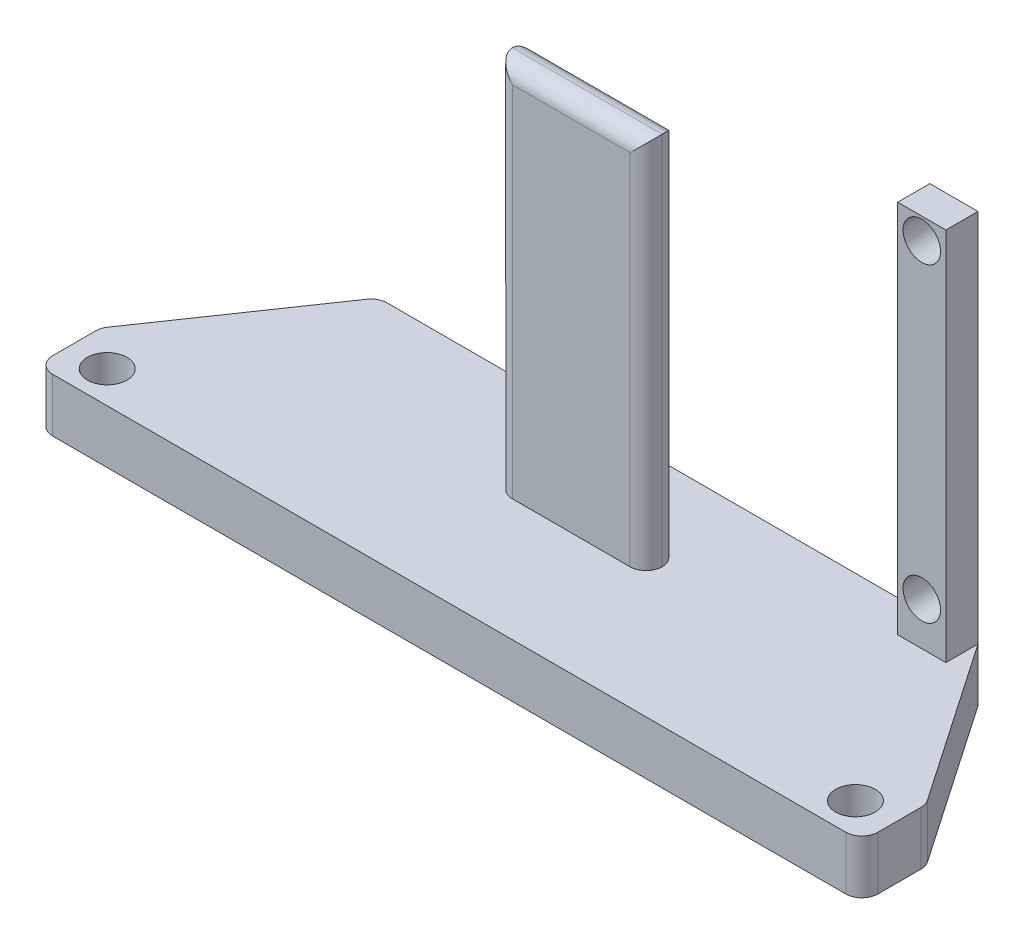
ISO-10303-21;
HEADER;
FILE_DESCRIPTION(('STEP AP214'),'2;1');
FILE_NAME('part.step','',(''),(''),'','','');
FILE_SCHEMA(('AUTOMOTIVE_DESIGN { 1 0 10303 214 1 1 1 1 }'));
ENDSEC;
DATA;
#1=APPLICATION_CONTEXT('core data for automotive mechanical design processes');
#2=APPLICATION_PROTOCOL_DEFINITION('international standard','automotive_design',2000,#1);
#3=PRODUCT_CONTEXT('',#1,'mechanical');
#4=PRODUCT('Part','Part','',(#3));
#5=PRODUCT_RELATED_PRODUCT_CATEGORY('part','',(#4));
#6=PRODUCT_DEFINITION_FORMATION('','',#4);
#7=PRODUCT_DEFINITION_CONTEXT('part definition',#1,'design');
#8=PRODUCT_DEFINITION('design','',#6,#7);
#9=PRODUCT_DEFINITION_SHAPE('','',#8);
#10=(LENGTH_UNIT() NAMED_UNIT(*) SI_UNIT(.MILLI.,.METRE.));
#11=(NAMED_UNIT(*) PLANE_ANGLE_UNIT() SI_UNIT($,.RADIAN.));
#12=(NAMED_UNIT(*) SI_UNIT($,.STERADIAN.) SOLID_ANGLE_UNIT());
#13=UNCERTAINTY_MEASURE_WITH_UNIT(LENGTH_MEASURE(1.E-05),#10,'distance_accuracy_value','');
#14=(GEOMETRIC_REPRESENTATION_CONTEXT(3) GLOBAL_UNCERTAINTY_ASSIGNED_CONTEXT((#13)) GLOBAL_UNIT_ASSIGNED_CONTEXT((#10,
#11,#12)) REPRESENTATION_CONTEXT('',''));
#15=CARTESIAN_POINT('',(0.,0.,0.));
#16=DIRECTION('',(0.,0.,1.));
#17=DIRECTION('',(1.,0.,0.));
#18=AXIS2_PLACEMENT_3D('',#15,#16,#17);
#19=CARTESIAN_POINT('',(0.,0.,0.));
#20=DIRECTION('',(0.,1.,0.));
#21=DIRECTION('',(0.,0.,1.));
#22=AXIS2_PLACEMENT_3D('',#19,#20,#21);
#23=PLANE('',#22);
#24=DIRECTION('',(1.,0.,0.));
#25=VECTOR('',#24,1.);
#26=CARTESIAN_POINT('',(-38.55,0.,0.));
#27=LINE('',#26,#25);
#28=CARTESIAN_POINT('',(-37.05,0.,0.));
#29=VERTEX_POINT('',#28);
#30=CARTESIAN_POINT('',(37.05,0.,0.));
#31=VERTEX_POINT('',#30);
#32=EDGE_CURVE('E248',#29,#31,#27,.T.);
#33=ORIENTED_EDGE('',*,*,#32,.T.);
#34=CARTESIAN_POINT('',(37.05,0.,-1.5));
#35=DIRECTION('',(0.,1.,0.));
#36=DIRECTION('',(0.,0.,1.));
#37=AXIS2_PLACEMENT_3D('',#34,#35,#36);
#38=CIRCLE('',#37,1.5);
#39=CARTESIAN_POINT('',(38.55,0.,-1.5));
#40=VERTEX_POINT('',#39);
#41=EDGE_CURVE('E326',#31,#40,#38,.T.);
#42=ORIENTED_EDGE('',*,*,#41,.T.);
#43=DIRECTION('',(0.,0.,-1.));
#44=VECTOR('',#43,1.);
#45=CARTESIAN_POINT('',(38.55,0.,0.));
#46=LINE('',#45,#44);
#47=CARTESIAN_POINT('',(38.55,0.,-5.53547626189279));
#48=VERTEX_POINT('',#47);
#49=EDGE_CURVE('E251',#40,#48,#46,.T.);
#50=ORIENTED_EDGE('',*,*,#49,.T.);
#51=CARTESIAN_POINT('',(37.05,0.,-5.53547626189279));
#52=DIRECTION('',(0.,1.,0.));
#53=DIRECTION('',(0.,0.,1.));
#54=AXIS2_PLACEMENT_3D('',#51,#52,#53);
#55=CIRCLE('',#54,1.5);
#56=CARTESIAN_POINT('',(38.2874679391047,0.,-6.3832221552405));
#57=VERTEX_POINT('',#56);
#58=EDGE_CURVE('E324',#48,#57,#55,.T.);
#59=ORIENTED_EDGE('',*,*,#58,.T.);
#60=DIRECTION('',(-0.565163928898476,0.,-0.824978626069814));
#61=VECTOR('',#60,1.);
#62=CARTESIAN_POINT('',(38.55,0.,-6.));
#63=LINE('',#62,#61);
#64=CARTESIAN_POINT('',(28.,0.,-21.4));
#65=VERTEX_POINT('',#64);
#66=EDGE_CURVE('E254',#57,#65,#63,.T.);
#67=ORIENTED_EDGE('',*,*,#66,.T.);
#68=DIRECTION('',(0.,0.,-1.));
#69=VECTOR('',#68,1.);
#70=CARTESIAN_POINT('',(28.,0.,-21.4));
#71=LINE('',#70,#69);
#72=CARTESIAN_POINT('',(28.,0.,-18.4));
#73=VERTEX_POINT('',#72);
#74=EDGE_CURVE('E209',#73,#65,#71,.T.);
#75=ORIENTED_EDGE('',*,*,#74,.F.);
#76=DIRECTION('',(1.,0.,0.));
#77=VECTOR('',#76,1.);
#78=CARTESIAN_POINT('',(28.,0.,-18.4));
#79=LINE('',#78,#77);
#80=CARTESIAN_POINT('',(23.5,0.,-18.4));
#81=VERTEX_POINT('',#80);
#82=EDGE_CURVE('E206',#81,#73,#79,.T.);
#83=ORIENTED_EDGE('',*,*,#82,.F.);
#84=DIRECTION('',(0.,0.,1.));
#85=VECTOR('',#84,1.);
#86=CARTESIAN_POINT('',(23.5,0.,-21.4));
#87=LINE('',#86,#85);
#88=CARTESIAN_POINT('',(23.5,0.,-21.4));
#89=VERTEX_POINT('',#88);
#90=EDGE_CURVE('E376',#89,#81,#87,.T.);
#91=ORIENTED_EDGE('',*,*,#90,.F.);
#92=DIRECTION('',(-1.,0.,0.));
#93=VECTOR('',#92,1.);
#94=CARTESIAN_POINT('',(28.,0.,-21.4));
#95=LINE('',#94,#93);
#96=CARTESIAN_POINT('',(-27.2093684781149,0.,-21.4));
#97=VERTEX_POINT('',#96);
#98=EDGE_CURVE('E256',#89,#97,#95,.T.);
#99=ORIENTED_EDGE('',*,*,#98,.T.);
#100=CARTESIAN_POINT('',(-27.2093684781149,0.,-19.9));
#101=DIRECTION('',(0.,1.,0.));
#102=DIRECTION('',(0.,0.,1.));
#103=AXIS2_PLACEMENT_3D('',#100,#101,#102);
#104=CIRCLE('',#103,1.5);
#105=CARTESIAN_POINT('',(-28.4468364172196,0.,-20.7477458933477));
#106=VERTEX_POINT('',#105);
#107=EDGE_CURVE('E322',#97,#106,#104,.T.);
#108=ORIENTED_EDGE('',*,*,#107,.T.);
#109=DIRECTION('',(-0.565163928898476,0.,0.824978626069814));
#110=VECTOR('',#109,1.);
#111=CARTESIAN_POINT('',(-38.55,0.,-6.));
#112=LINE('',#111,#110);
#113=CARTESIAN_POINT('',(-38.2874679391047,0.,-6.3832221552405));
#114=VERTEX_POINT('',#113);
#115=EDGE_CURVE('E232',#106,#114,#112,.T.);
#116=ORIENTED_EDGE('',*,*,#115,.T.);
#117=CARTESIAN_POINT('',(-37.05,0.,-5.53547626189279));
#118=DIRECTION('',(0.,1.,0.));
#119=DIRECTION('',(0.,0.,1.));
#120=AXIS2_PLACEMENT_3D('',#117,#118,#119);
#121=CIRCLE('',#120,1.5);
#122=CARTESIAN_POINT('',(-38.55,0.,-5.53547626189279));
#123=VERTEX_POINT('',#122);
#124=EDGE_CURVE('E320',#114,#123,#121,.T.);
#125=ORIENTED_EDGE('',*,*,#124,.T.);
#126=DIRECTION('',(0.,0.,1.));
#127=VECTOR('',#126,1.);
#128=CARTESIAN_POINT('',(-38.55,0.,0.));
#129=LINE('',#128,#127);
#130=CARTESIAN_POINT('',(-38.55,0.,-1.5));
#131=VERTEX_POINT('',#130);
#132=EDGE_CURVE('E225',#123,#131,#129,.T.);
#133=ORIENTED_EDGE('',*,*,#132,.T.);
#134=CARTESIAN_POINT('',(-37.05,0.,-1.5));
#135=DIRECTION('',(0.,1.,0.));
#136=DIRECTION('',(0.,0.,1.));
#137=AXIS2_PLACEMENT_3D('',#134,#135,#136);
#138=CIRCLE('',#137,1.5);
#139=EDGE_CURVE('E318',#131,#29,#138,.T.);
#140=ORIENTED_EDGE('',*,*,#139,.T.);
#141=EDGE_LOOP('',(#33,#42,#50,#59,#67,#75,#83,#91,#99,#108,#116,#125,#133,#140));
#142=FACE_BOUND('',#141,.T.);
#143=CARTESIAN_POINT('',(34.95,0.,-3.));
#144=DIRECTION('',(0.,1.,0.));
#145=DIRECTION('',(0.,0.,1.));
#146=AXIS2_PLACEMENT_3D('',#143,#144,#145);
#147=CIRCLE('',#146,1.85);
#148=CARTESIAN_POINT('',(34.95,0.,-1.15));
#149=VERTEX_POINT('',#148);
#150=EDGE_CURVE('E210',#149,#149,#147,.T.);
#151=ORIENTED_EDGE('',*,*,#150,.F.);
#152=EDGE_LOOP('',(#151));
#153=FACE_BOUND('',#152,.T.);
#154=CARTESIAN_POINT('',(-34.95,0.,-3.));
#155=DIRECTION('',(0.,1.,0.));
#156=DIRECTION('',(0.,0.,1.));
#157=AXIS2_PLACEMENT_3D('',#154,#155,#156);
#158=CIRCLE('',#157,1.85);
#159=CARTESIAN_POINT('',(-34.95,0.,-1.15));
#160=VERTEX_POINT('',#159);
#161=EDGE_CURVE('E220',#160,#160,#158,.T.);
#162=ORIENTED_EDGE('',*,*,#161,.F.);
#163=EDGE_LOOP('',(#162));
#164=FACE_BOUND('',#163,.T.);
#165=DIRECTION('',(1.,0.,0.));
#166=VECTOR('',#165,1.);
#167=CARTESIAN_POINT('',(-7.,0.,-11.4));
#168=LINE('',#167,#166);
#169=CARTESIAN_POINT('',(-5.5,0.,-11.4));
#170=VERTEX_POINT('',#169);
#171=CARTESIAN_POINT('',(5.5,0.,-11.4));
#172=VERTEX_POINT('',#171);
#173=EDGE_CURVE('E383',#170,#172,#168,.T.);
#174=ORIENTED_EDGE('',*,*,#173,.F.);
#175=CARTESIAN_POINT('',(-5.5,0.,-12.9));
#176=DIRECTION('',(0.,1.,0.));
#177=DIRECTION('',(0.,0.,1.));
#178=AXIS2_PLACEMENT_3D('',#175,#176,#177);
#179=CIRCLE('',#178,1.5);
#180=CARTESIAN_POINT('',(-7.,0.,-12.9));
#181=VERTEX_POINT('',#180);
#182=EDGE_CURVE('E286',#170,#181,#179,.F.);
#183=ORIENTED_EDGE('',*,*,#182,.T.);
#184=CARTESIAN_POINT('',(-5.5,0.,-12.9));
#185=DIRECTION('',(0.,1.,0.));
#186=DIRECTION('',(0.,0.,1.));
#187=AXIS2_PLACEMENT_3D('',#184,#185,#186);
#188=CIRCLE('',#187,1.5);
#189=CARTESIAN_POINT('',(-5.5,0.,-14.4));
#190=VERTEX_POINT('',#189);
#191=EDGE_CURVE('E284',#181,#190,#188,.F.);
#192=ORIENTED_EDGE('',*,*,#191,.T.);
#193=DIRECTION('',(-1.,0.,0.));
#194=VECTOR('',#193,1.);
#195=CARTESIAN_POINT('',(-7.,0.,-14.4));
#196=LINE('',#195,#194);
#197=CARTESIAN_POINT('',(5.5,0.,-14.4));
#198=VERTEX_POINT('',#197);
#199=EDGE_CURVE('E271',#198,#190,#196,.T.);
#200=ORIENTED_EDGE('',*,*,#199,.F.);
#201=CARTESIAN_POINT('',(5.5,0.,-12.9));
#202=DIRECTION('',(0.,1.,0.));
#203=DIRECTION('',(0.,0.,1.));
#204=AXIS2_PLACEMENT_3D('',#201,#202,#203);
#205=CIRCLE('',#204,1.5);
#206=CARTESIAN_POINT('',(7.,0.,-12.9));
#207=VERTEX_POINT('',#206);
#208=EDGE_CURVE('E288',#198,#207,#205,.F.);
#209=ORIENTED_EDGE('',*,*,#208,.T.);
#210=CARTESIAN_POINT('',(5.5,0.,-12.9));
#211=DIRECTION('',(0.,1.,0.));
#212=DIRECTION('',(0.,0.,1.));
#213=AXIS2_PLACEMENT_3D('',#210,#211,#212);
#214=CIRCLE('',#213,1.5);
#215=EDGE_CURVE('E290',#207,#172,#214,.F.);
#216=ORIENTED_EDGE('',*,*,#215,.T.);
#217=EDGE_LOOP('',(#174,#183,#192,#200,#209,#216));
#218=FACE_BOUND('',#217,.T.);
#219=ADVANCED_FACE('F42',(#142,#153,#164,#218),#23,.T.);
#220=CARTESIAN_POINT('',(-38.55,-5.,0.));
#221=DIRECTION('',(-1.,0.,0.));
#222=DIRECTION('',(0.,0.,1.));
#223=AXIS2_PLACEMENT_3D('',#220,#221,#222);
#224=PLANE('',#223);
#225=ORIENTED_EDGE('',*,*,#132,.F.);
#226=DIRECTION('',(0.,1.,0.));
#227=VECTOR('',#226,1.);
#228=CARTESIAN_POINT('',(-38.55,-5.,-5.53547626189279));
#229=LINE('',#228,#227);
#230=CARTESIAN_POINT('',(-38.55,-5.,-5.53547626189279));
#231=VERTEX_POINT('',#230);
#232=EDGE_CURVE('E11',#123,#231,#229,.F.);
#233=ORIENTED_EDGE('',*,*,#232,.T.);
#234=DIRECTION('',(0.,0.,1.));
#235=VECTOR('',#234,1.);
#236=CARTESIAN_POINT('',(-38.55,-5.,0.));
#237=LINE('',#236,#235);
#238=CARTESIAN_POINT('',(-38.55,-5.,-1.5));
#239=VERTEX_POINT('',#238);
#240=EDGE_CURVE('E228',#231,#239,#237,.T.);
#241=ORIENTED_EDGE('',*,*,#240,.T.);
#242=DIRECTION('',(0.,1.,0.));
#243=VECTOR('',#242,1.);
#244=CARTESIAN_POINT('',(-38.55,-5.,-1.5));
#245=LINE('',#244,#243);
#246=EDGE_CURVE('E50',#239,#131,#245,.T.);
#247=ORIENTED_EDGE('',*,*,#246,.T.);
#248=EDGE_LOOP('',(#225,#233,#241,#247));
#249=FACE_BOUND('',#248,.T.);
#250=ADVANCED_FACE('F354',(#249),#224,.T.);
#251=CARTESIAN_POINT('',(-38.55,-5.,-6.));
#252=DIRECTION('',(-0.824978626069814,0.,-0.565163928898476));
#253=DIRECTION('',(-0.565163928898476,0.,0.824978626069814));
#254=AXIS2_PLACEMENT_3D('',#251,#252,#253);
#255=PLANE('',#254);
#256=ORIENTED_EDGE('',*,*,#115,.F.);
#257=DIRECTION('',(0.,1.,0.));
#258=VECTOR('',#257,1.);
#259=CARTESIAN_POINT('',(-28.4468364172196,-5.,-20.7477458933477));
#260=LINE('',#259,#258);
#261=CARTESIAN_POINT('',(-28.4468364172196,-5.,-20.7477458933477));
#262=VERTEX_POINT('',#261);
#263=EDGE_CURVE('E349',#106,#262,#260,.F.);
#264=ORIENTED_EDGE('',*,*,#263,.T.);
#265=DIRECTION('',(-0.565163928898476,0.,0.824978626069814));
#266=VECTOR('',#265,1.);
#267=CARTESIAN_POINT('',(-38.55,-5.,-6.));
#268=LINE('',#267,#266);
#269=CARTESIAN_POINT('',(-38.2874679391047,-5.,-6.3832221552405));
#270=VERTEX_POINT('',#269);
#271=EDGE_CURVE('E242',#262,#270,#268,.T.);
#272=ORIENTED_EDGE('',*,*,#271,.T.);
#273=DIRECTION('',(0.,1.,0.));
#274=VECTOR('',#273,1.);
#275=CARTESIAN_POINT('',(-38.2874679391047,-5.,-6.3832221552405));
#276=LINE('',#275,#274);
#277=EDGE_CURVE('E346',#270,#114,#276,.T.);
#278=ORIENTED_EDGE('',*,*,#277,.T.);
#279=EDGE_LOOP('',(#256,#264,#272,#278));
#280=FACE_BOUND('',#279,.T.);
#281=ADVANCED_FACE('F368',(#280),#255,.T.);
#282=CARTESIAN_POINT('',(28.,-5.,-21.4));
#283=DIRECTION('',(0.,0.,-1.));
#284=DIRECTION('',(-1.,0.,0.));
#285=AXIS2_PLACEMENT_3D('',#282,#283,#284);
#286=PLANE('',#285);
#287=CARTESIAN_POINT('',(25.75,33.,-21.4));
#288=DIRECTION('',(0.,0.,1.));
#289=DIRECTION('',(1.,0.,0.));
#290=AXIS2_PLACEMENT_3D('',#287,#288,#289);
#291=CIRCLE('',#290,1.75);
#292=CARTESIAN_POINT('',(27.5,33.,-21.4));
#293=VERTEX_POINT('',#292);
#294=EDGE_CURVE('E268',#293,#293,#291,.T.);
#295=ORIENTED_EDGE('',*,*,#294,.T.);
#296=EDGE_LOOP('',(#295));
#297=FACE_BOUND('',#296,.T.);
#298=CARTESIAN_POINT('',(25.75,4.,-21.4));
#299=DIRECTION('',(0.,0.,1.));
#300=DIRECTION('',(1.,0.,0.));
#301=AXIS2_PLACEMENT_3D('',#298,#299,#300);
#302=CIRCLE('',#301,1.75);
#303=CARTESIAN_POINT('',(27.5,4.,-21.4));
#304=VERTEX_POINT('',#303);
#305=EDGE_CURVE('E313',#304,#304,#302,.T.);
#306=ORIENTED_EDGE('',*,*,#305,.T.);
#307=EDGE_LOOP('',(#306));
#308=FACE_BOUND('',#307,.T.);
#309=DIRECTION('',(-1.,0.,0.));
#310=VECTOR('',#309,1.);
#311=CARTESIAN_POINT('',(28.,-5.,-21.4));
#312=LINE('',#311,#310);
#313=CARTESIAN_POINT('',(28.,-5.,-21.4));
#314=VERTEX_POINT('',#313);
#315=CARTESIAN_POINT('',(-27.2093684781149,-5.,-21.4));
#316=VERTEX_POINT('',#315);
#317=EDGE_CURVE('E240',#314,#316,#312,.T.);
#318=ORIENTED_EDGE('',*,*,#317,.T.);
#319=DIRECTION('',(0.,1.,0.));
#320=VECTOR('',#319,1.);
#321=CARTESIAN_POINT('',(-27.2093684781149,-5.,-21.4));
#322=LINE('',#321,#320);
#323=EDGE_CURVE('E343',#316,#97,#322,.T.);
#324=ORIENTED_EDGE('',*,*,#323,.T.);
#325=ORIENTED_EDGE('',*,*,#98,.F.);
#326=DIRECTION('',(0.,-1.,0.));
#327=VECTOR('',#326,1.);
#328=CARTESIAN_POINT('',(23.5,35.,-21.4));
#329=LINE('',#328,#327);
#330=CARTESIAN_POINT('',(23.5,35.,-21.4));
#331=VERTEX_POINT('',#330);
#332=EDGE_CURVE('E193',#331,#89,#329,.T.);
#333=ORIENTED_EDGE('',*,*,#332,.F.);
#334=DIRECTION('',(-1.,0.,0.));
#335=VECTOR('',#334,1.);
#336=CARTESIAN_POINT('',(28.,35.,-21.4));
#337=LINE('',#336,#335);
#338=CARTESIAN_POINT('',(28.,35.,-21.4));
#339=VERTEX_POINT('',#338);
#340=EDGE_CURVE('E184',#339,#331,#337,.T.);
#341=ORIENTED_EDGE('',*,*,#340,.F.);
#342=DIRECTION('',(0.,-1.,0.));
#343=VECTOR('',#342,1.);
#344=CARTESIAN_POINT('',(28.,35.,-21.4));
#345=LINE('',#344,#343);
#346=EDGE_CURVE('E189',#339,#65,#345,.T.);
#347=ORIENTED_EDGE('',*,*,#346,.T.);
#348=DIRECTION('',(0.,1.,0.));
#349=VECTOR('',#348,1.);
#350=CARTESIAN_POINT('',(28.,-5.,-21.4));
#351=LINE('',#350,#349);
#352=EDGE_CURVE('E245',#314,#65,#351,.T.);
#353=ORIENTED_EDGE('',*,*,#352,.F.);
#354=EDGE_LOOP('',(#318,#324,#325,#333,#341,#347,#353));
#355=FACE_BOUND('',#354,.T.);
#356=ADVANCED_FACE('F186',(#297,#308,#355),#286,.T.);
#357=CARTESIAN_POINT('',(38.55,-5.,-6.));
#358=DIRECTION('',(0.824978626069814,0.,-0.565163928898476));
#359=DIRECTION('',(-0.565163928898476,0.,-0.824978626069814));
#360=AXIS2_PLACEMENT_3D('',#357,#358,#359);
#361=PLANE('',#360);
#362=ORIENTED_EDGE('',*,*,#66,.F.);
#363=DIRECTION('',(0.,1.,0.));
#364=VECTOR('',#363,1.);
#365=CARTESIAN_POINT('',(38.2874679391047,-5.,-6.3832221552405));
#366=LINE('',#365,#364);
#367=CARTESIAN_POINT('',(38.2874679391047,-5.,-6.3832221552405));
#368=VERTEX_POINT('',#367);
#369=EDGE_CURVE('E57',#57,#368,#366,.F.);
#370=ORIENTED_EDGE('',*,*,#369,.T.);
#371=DIRECTION('',(-0.565163928898476,0.,-0.824978626069814));
#372=VECTOR('',#371,1.);
#373=CARTESIAN_POINT('',(38.55,-5.,-6.));
#374=LINE('',#373,#372);
#375=EDGE_CURVE('E238',#368,#314,#374,.T.);
#376=ORIENTED_EDGE('',*,*,#375,.T.);
#377=ORIENTED_EDGE('',*,*,#352,.T.);
#378=EDGE_LOOP('',(#362,#370,#376,#377));
#379=FACE_BOUND('',#378,.T.);
#380=ADVANCED_FACE('F444',(#379),#361,.T.);
#381=CARTESIAN_POINT('',(38.55,-5.,0.));
#382=DIRECTION('',(1.,0.,0.));
#383=DIRECTION('',(0.,0.,-1.));
#384=AXIS2_PLACEMENT_3D('',#381,#382,#383);
#385=PLANE('',#384);
#386=ORIENTED_EDGE('',*,*,#49,.F.);
#387=DIRECTION('',(0.,1.,0.));
#388=VECTOR('',#387,1.);
#389=CARTESIAN_POINT('',(38.55,-5.,-1.5));
#390=LINE('',#389,#388);
#391=CARTESIAN_POINT('',(38.55,-5.,-1.5));
#392=VERTEX_POINT('',#391);
#393=EDGE_CURVE('E331',#40,#392,#390,.F.);
#394=ORIENTED_EDGE('',*,*,#393,.T.);
#395=DIRECTION('',(0.,0.,-1.));
#396=VECTOR('',#395,1.);
#397=CARTESIAN_POINT('',(38.55,-5.,0.));
#398=LINE('',#397,#396);
#399=CARTESIAN_POINT('',(38.55,-5.,-5.53547626189279));
#400=VERTEX_POINT('',#399);
#401=EDGE_CURVE('E235',#392,#400,#398,.T.);
#402=ORIENTED_EDGE('',*,*,#401,.T.);
#403=DIRECTION('',(0.,1.,0.));
#404=VECTOR('',#403,1.);
#405=CARTESIAN_POINT('',(38.55,-5.,-5.53547626189279));
#406=LINE('',#405,#404);
#407=EDGE_CURVE('E328',#400,#48,#406,.T.);
#408=ORIENTED_EDGE('',*,*,#407,.T.);
#409=EDGE_LOOP('',(#386,#394,#402,#408));
#410=FACE_BOUND('',#409,.T.);
#411=ADVANCED_FACE('F447',(#410),#385,.T.);
#412=CARTESIAN_POINT('',(-38.55,-5.,0.));
#413=DIRECTION('',(0.,0.,1.));
#414=DIRECTION('',(1.,0.,0.));
#415=AXIS2_PLACEMENT_3D('',#412,#413,#414);
#416=PLANE('',#415);
#417=DIRECTION('',(1.,0.,0.));
#418=VECTOR('',#417,1.);
#419=CARTESIAN_POINT('',(-38.55,-5.,0.));
#420=LINE('',#419,#418);
#421=CARTESIAN_POINT('',(-37.05,-5.,0.));
#422=VERTEX_POINT('',#421);
#423=CARTESIAN_POINT('',(37.05,-5.,0.));
#424=VERTEX_POINT('',#423);
#425=EDGE_CURVE('E231',#422,#424,#420,.T.);
#426=ORIENTED_EDGE('',*,*,#425,.T.);
#427=DIRECTION('',(0.,1.,0.));
#428=VECTOR('',#427,1.);
#429=CARTESIAN_POINT('',(37.05,-5.,0.));
#430=LINE('',#429,#428);
#431=EDGE_CURVE('E315',#424,#31,#430,.T.);
#432=ORIENTED_EDGE('',*,*,#431,.T.);
#433=ORIENTED_EDGE('',*,*,#32,.F.);
#434=DIRECTION('',(0.,1.,0.));
#435=VECTOR('',#434,1.);
#436=CARTESIAN_POINT('',(-37.05,-5.,0.));
#437=LINE('',#436,#435);
#438=EDGE_CURVE('E292',#29,#422,#437,.F.);
#439=ORIENTED_EDGE('',*,*,#438,.T.);
#440=EDGE_LOOP('',(#426,#432,#433,#439));
#441=FACE_BOUND('',#440,.T.);
#442=ADVANCED_FACE('F450',(#441),#416,.T.);
#443=CARTESIAN_POINT('',(0.,-5.,0.));
#444=DIRECTION('',(0.,1.,0.));
#445=DIRECTION('',(0.,0.,1.));
#446=AXIS2_PLACEMENT_3D('',#443,#444,#445);
#447=PLANE('',#446);
#448=CARTESIAN_POINT('',(34.95,-5.,-3.));
#449=DIRECTION('',(0.,1.,0.));
#450=DIRECTION('',(0.,0.,1.));
#451=AXIS2_PLACEMENT_3D('',#448,#449,#450);
#452=CIRCLE('',#451,1.85);
#453=CARTESIAN_POINT('',(34.95,-5.,-1.15));
#454=VERTEX_POINT('',#453);
#455=EDGE_CURVE('E213',#454,#454,#452,.T.);
#456=ORIENTED_EDGE('',*,*,#455,.T.);
#457=EDGE_LOOP('',(#456));
#458=FACE_BOUND('',#457,.T.);
#459=CARTESIAN_POINT('',(-34.95,-5.,-3.));
#460=DIRECTION('',(0.,1.,0.));
#461=DIRECTION('',(0.,0.,1.));
#462=AXIS2_PLACEMENT_3D('',#459,#460,#461);
#463=CIRCLE('',#462,1.85);
#464=CARTESIAN_POINT('',(-34.95,-5.,-1.15));
#465=VERTEX_POINT('',#464);
#466=EDGE_CURVE('E222',#465,#465,#463,.T.);
#467=ORIENTED_EDGE('',*,*,#466,.T.);
#468=EDGE_LOOP('',(#467));
#469=FACE_BOUND('',#468,.T.);
#470=ORIENTED_EDGE('',*,*,#401,.F.);
#471=CARTESIAN_POINT('',(37.05,-5.,-1.5));
#472=DIRECTION('',(0.,1.,0.));
#473=DIRECTION('',(0.,0.,1.));
#474=AXIS2_PLACEMENT_3D('',#471,#472,#473);
#475=CIRCLE('',#474,1.5);
#476=EDGE_CURVE('E340',#392,#424,#475,.F.);
#477=ORIENTED_EDGE('',*,*,#476,.T.);
#478=ORIENTED_EDGE('',*,*,#425,.F.);
#479=CARTESIAN_POINT('',(-37.05,-5.,-1.5));
#480=DIRECTION('',(0.,1.,0.));
#481=DIRECTION('',(0.,0.,1.));
#482=AXIS2_PLACEMENT_3D('',#479,#480,#481);
#483=CIRCLE('',#482,1.5);
#484=EDGE_CURVE('E333',#422,#239,#483,.F.);
#485=ORIENTED_EDGE('',*,*,#484,.T.);
#486=ORIENTED_EDGE('',*,*,#240,.F.);
#487=CARTESIAN_POINT('',(-37.05,-5.,-5.53547626189279));
#488=DIRECTION('',(0.,1.,0.));
#489=DIRECTION('',(0.,0.,1.));
#490=AXIS2_PLACEMENT_3D('',#487,#488,#489);
#491=CIRCLE('',#490,1.5);
#492=EDGE_CURVE('E335',#231,#270,#491,.F.);
#493=ORIENTED_EDGE('',*,*,#492,.T.);
#494=ORIENTED_EDGE('',*,*,#271,.F.);
#495=CARTESIAN_POINT('',(-27.2093684781149,-5.,-19.9));
#496=DIRECTION('',(0.,1.,0.));
#497=DIRECTION('',(0.,0.,1.));
#498=AXIS2_PLACEMENT_3D('',#495,#496,#497);
#499=CIRCLE('',#498,1.5);
#500=EDGE_CURVE('E65',#262,#316,#499,.F.);
#501=ORIENTED_EDGE('',*,*,#500,.T.);
#502=ORIENTED_EDGE('',*,*,#317,.F.);
#503=ORIENTED_EDGE('',*,*,#375,.F.);
#504=CARTESIAN_POINT('',(37.05,-5.,-5.53547626189279));
#505=DIRECTION('',(0.,1.,0.));
#506=DIRECTION('',(0.,0.,1.));
#507=AXIS2_PLACEMENT_3D('',#504,#505,#506);
#508=CIRCLE('',#507,1.5);
#509=EDGE_CURVE('E338',#368,#400,#508,.F.);
#510=ORIENTED_EDGE('',*,*,#509,.T.);
#511=EDGE_LOOP('',(#470,#477,#478,#485,#486,#493,#494,#501,#502,#503,#510));
#512=FACE_BOUND('',#511,.T.);
#513=ADVANCED_FACE('F371',(#458,#469,#512),#447,.F.);
#514=CARTESIAN_POINT('',(-34.95,-5.,-3.));
#515=DIRECTION('',(0.,1.,0.));
#516=DIRECTION('',(0.,0.,1.));
#517=AXIS2_PLACEMENT_3D('',#514,#515,#516);
#518=CYLINDRICAL_SURFACE('',#517,1.85);
#519=ORIENTED_EDGE('',*,*,#466,.F.);
#520=EDGE_LOOP('',(#519));
#521=FACE_BOUND('',#520,.T.);
#522=ORIENTED_EDGE('',*,*,#161,.T.);
#523=EDGE_LOOP('',(#522));
#524=FACE_BOUND('',#523,.T.);
#525=ADVANCED_FACE('F536',(#521,#524),#518,.F.);
#526=CARTESIAN_POINT('',(34.95,-5.,-3.));
#527=DIRECTION('',(0.,1.,0.));
#528=DIRECTION('',(0.,0.,1.));
#529=AXIS2_PLACEMENT_3D('',#526,#527,#528);
#530=CYLINDRICAL_SURFACE('',#529,1.85);
#531=ORIENTED_EDGE('',*,*,#455,.F.);
#532=EDGE_LOOP('',(#531));
#533=FACE_BOUND('',#532,.T.);
#534=ORIENTED_EDGE('',*,*,#150,.T.);
#535=EDGE_LOOP('',(#534));
#536=FACE_BOUND('',#535,.T.);
#537=ADVANCED_FACE('F577',(#533,#536),#530,.F.);
#538=CARTESIAN_POINT('',(28.,35.,-21.4));
#539=DIRECTION('',(-1.,0.,0.));
#540=DIRECTION('',(0.,0.,1.));
#541=AXIS2_PLACEMENT_3D('',#538,#539,#540);
#542=PLANE('',#541);
#543=ORIENTED_EDGE('',*,*,#74,.T.);
#544=ORIENTED_EDGE('',*,*,#346,.F.);
#545=DIRECTION('',(0.,0.,-1.));
#546=VECTOR('',#545,1.);
#547=CARTESIAN_POINT('',(28.,35.,-21.4));
#548=LINE('',#547,#546);
#549=CARTESIAN_POINT('',(28.,35.,-18.4));
#550=VERTEX_POINT('',#549);
#551=EDGE_CURVE('E197',#550,#339,#548,.T.);
#552=ORIENTED_EDGE('',*,*,#551,.F.);
#553=DIRECTION('',(0.,-1.,0.));
#554=VECTOR('',#553,1.);
#555=CARTESIAN_POINT('',(28.,35.,-18.4));
#556=LINE('',#555,#554);
#557=EDGE_CURVE('E387',#550,#73,#556,.T.);
#558=ORIENTED_EDGE('',*,*,#557,.T.);
#559=EDGE_LOOP('',(#543,#544,#552,#558));
#560=FACE_BOUND('',#559,.T.);
#561=ADVANCED_FACE('F208',(#560),#542,.F.);
#562=CARTESIAN_POINT('',(23.5,35.,-21.4));
#563=DIRECTION('',(1.,0.,0.));
#564=DIRECTION('',(0.,0.,-1.));
#565=AXIS2_PLACEMENT_3D('',#562,#563,#564);
#566=PLANE('',#565);
#567=ORIENTED_EDGE('',*,*,#90,.T.);
#568=DIRECTION('',(0.,-1.,0.));
#569=VECTOR('',#568,1.);
#570=CARTESIAN_POINT('',(23.5,35.,-18.4));
#571=LINE('',#570,#569);
#572=CARTESIAN_POINT('',(23.5,35.,-18.4));
#573=VERTEX_POINT('',#572);
#574=EDGE_CURVE('E215',#573,#81,#571,.T.);
#575=ORIENTED_EDGE('',*,*,#574,.F.);
#576=DIRECTION('',(0.,0.,1.));
#577=VECTOR('',#576,1.);
#578=CARTESIAN_POINT('',(23.5,35.,-21.4));
#579=LINE('',#578,#577);
#580=EDGE_CURVE('E196',#331,#573,#579,.T.);
#581=ORIENTED_EDGE('',*,*,#580,.F.);
#582=ORIENTED_EDGE('',*,*,#332,.T.);
#583=EDGE_LOOP('',(#567,#575,#581,#582));
#584=FACE_BOUND('',#583,.T.);
#585=ADVANCED_FACE('F390',(#584),#566,.F.);
#586=CARTESIAN_POINT('',(28.,35.,-18.4));
#587=DIRECTION('',(0.,0.,-1.));
#588=DIRECTION('',(-1.,0.,0.));
#589=AXIS2_PLACEMENT_3D('',#586,#587,#588);
#590=PLANE('',#589);
#591=CARTESIAN_POINT('',(25.75,33.,-18.4));
#592=DIRECTION('',(0.,0.,-1.));
#593=DIRECTION('',(-1.,0.,0.));
#594=AXIS2_PLACEMENT_3D('',#591,#592,#593);
#595=CIRCLE('',#594,1.75);
#596=CARTESIAN_POINT('',(24.,33.,-18.4));
#597=VERTEX_POINT('',#596);
#598=EDGE_CURVE('E267',#597,#597,#595,.F.);
#599=ORIENTED_EDGE('',*,*,#598,.F.);
#600=EDGE_LOOP('',(#599));
#601=FACE_BOUND('',#600,.T.);
#602=CARTESIAN_POINT('',(25.75,4.,-18.4));
#603=DIRECTION('',(0.,0.,-1.));
#604=DIRECTION('',(-1.,0.,0.));
#605=AXIS2_PLACEMENT_3D('',#602,#603,#604);
#606=CIRCLE('',#605,1.75);
#607=CARTESIAN_POINT('',(24.,4.,-18.4));
#608=VERTEX_POINT('',#607);
#609=EDGE_CURVE('E264',#608,#608,#606,.F.);
#610=ORIENTED_EDGE('',*,*,#609,.F.);
#611=EDGE_LOOP('',(#610));
#612=FACE_BOUND('',#611,.T.);
#613=ORIENTED_EDGE('',*,*,#82,.T.);
#614=ORIENTED_EDGE('',*,*,#557,.F.);
#615=DIRECTION('',(1.,0.,0.));
#616=VECTOR('',#615,1.);
#617=CARTESIAN_POINT('',(28.,35.,-18.4));
#618=LINE('',#617,#616);
#619=EDGE_CURVE('E202',#573,#550,#618,.T.);
#620=ORIENTED_EDGE('',*,*,#619,.F.);
#621=ORIENTED_EDGE('',*,*,#574,.T.);
#622=EDGE_LOOP('',(#613,#614,#620,#621));
#623=FACE_BOUND('',#622,.T.);
#624=ADVANCED_FACE('F389',(#601,#612,#623),#590,.F.);
#625=CARTESIAN_POINT('',(0.,35.,0.));
#626=DIRECTION('',(0.,-1.,0.));
#627=DIRECTION('',(0.,0.,-1.));
#628=AXIS2_PLACEMENT_3D('',#625,#626,#627);
#629=PLANE('',#628);
#630=ORIENTED_EDGE('',*,*,#551,.T.);
#631=ORIENTED_EDGE('',*,*,#340,.T.);
#632=ORIENTED_EDGE('',*,*,#580,.T.);
#633=ORIENTED_EDGE('',*,*,#619,.T.);
#634=EDGE_LOOP('',(#630,#631,#632,#633));
#635=FACE_BOUND('',#634,.T.);
#636=ADVANCED_FACE('F200',(#635),#629,.F.);
#637=CARTESIAN_POINT('',(-7.,35.,-11.4));
#638=DIRECTION('',(0.,0.,-1.));
#639=DIRECTION('',(-1.,0.,0.));
#640=AXIS2_PLACEMENT_3D('',#637,#638,#639);
#641=PLANE('',#640);
#642=DIRECTION('',(1.,0.,0.));
#643=VECTOR('',#642,1.);
#644=CARTESIAN_POINT('',(-7.,33.5,-11.4));
#645=LINE('',#644,#643);
#646=CARTESIAN_POINT('',(5.5,33.5,-11.4));
#647=VERTEX_POINT('',#646);
#648=CARTESIAN_POINT('',(-5.5,33.5,-11.4));
#649=VERTEX_POINT('',#648);
#650=EDGE_CURVE('E278',#647,#649,#645,.F.);
#651=ORIENTED_EDGE('',*,*,#650,.T.);
#652=DIRECTION('',(0.,-1.,0.));
#653=VECTOR('',#652,1.);
#654=CARTESIAN_POINT('',(-5.5,35.,-11.4));
#655=LINE('',#654,#653);
#656=EDGE_CURVE('E282',#649,#170,#655,.T.);
#657=ORIENTED_EDGE('',*,*,#656,.T.);
#658=ORIENTED_EDGE('',*,*,#173,.T.);
#659=DIRECTION('',(0.,-1.,0.));
#660=VECTOR('',#659,1.);
#661=CARTESIAN_POINT('',(5.5,35.,-11.4));
#662=LINE('',#661,#660);
#663=EDGE_CURVE('E280',#172,#647,#662,.F.);
#664=ORIENTED_EDGE('',*,*,#663,.T.);
#665=EDGE_LOOP('',(#651,#657,#658,#664));
#666=FACE_BOUND('',#665,.T.);
#667=ADVANCED_FACE('F425',(#666),#641,.F.);
#668=CARTESIAN_POINT('',(-7.,35.,-14.4));
#669=DIRECTION('',(0.,0.,1.));
#670=DIRECTION('',(1.,0.,0.));
#671=AXIS2_PLACEMENT_3D('',#668,#669,#670);
#672=PLANE('',#671);
#673=ORIENTED_EDGE('',*,*,#199,.T.);
#674=DIRECTION('',(0.,-1.,0.));
#675=VECTOR('',#674,1.);
#676=CARTESIAN_POINT('',(-5.5,35.,-14.4));
#677=LINE('',#676,#675);
#678=CARTESIAN_POINT('',(-5.5,33.5,-14.4));
#679=VERTEX_POINT('',#678);
#680=EDGE_CURVE('E275',#190,#679,#677,.F.);
#681=ORIENTED_EDGE('',*,*,#680,.T.);
#682=DIRECTION('',(-1.,0.,0.));
#683=VECTOR('',#682,1.);
#684=CARTESIAN_POINT('',(7.,33.5,-14.4));
#685=LINE('',#684,#683);
#686=CARTESIAN_POINT('',(5.5,33.5,-14.4));
#687=VERTEX_POINT('',#686);
#688=EDGE_CURVE('E263',#679,#687,#685,.F.);
#689=ORIENTED_EDGE('',*,*,#688,.T.);
#690=DIRECTION('',(0.,-1.,0.));
#691=VECTOR('',#690,1.);
#692=CARTESIAN_POINT('',(5.5,35.,-14.4));
#693=LINE('',#692,#691);
#694=EDGE_CURVE('E273',#687,#198,#693,.T.);
#695=ORIENTED_EDGE('',*,*,#694,.T.);
#696=EDGE_LOOP('',(#673,#681,#689,#695));
#697=FACE_BOUND('',#696,.T.);
#698=ADVANCED_FACE('F418',(#697),#672,.F.);
#699=CARTESIAN_POINT('',(25.75,4.,13.6));
#700=DIRECTION('',(0.,0.,-1.));
#701=DIRECTION('',(-1.,0.,0.));
#702=AXIS2_PLACEMENT_3D('',#699,#700,#701);
#703=CYLINDRICAL_SURFACE('',#702,1.75);
#704=ORIENTED_EDGE('',*,*,#305,.F.);
#705=EDGE_LOOP('',(#704));
#706=FACE_BOUND('',#705,.T.);
#707=ORIENTED_EDGE('',*,*,#609,.T.);
#708=EDGE_LOOP('',(#707));
#709=FACE_BOUND('',#708,.T.);
#710=ADVANCED_FACE('F408',(#706,#709),#703,.F.);
#711=CARTESIAN_POINT('',(25.75,33.,13.6));
#712=DIRECTION('',(0.,0.,-1.));
#713=DIRECTION('',(-1.,0.,0.));
#714=AXIS2_PLACEMENT_3D('',#711,#712,#713);
#715=CYLINDRICAL_SURFACE('',#714,1.75);
#716=ORIENTED_EDGE('',*,*,#294,.F.);
#717=EDGE_LOOP('',(#716));
#718=FACE_BOUND('',#717,.T.);
#719=ORIENTED_EDGE('',*,*,#598,.T.);
#720=EDGE_LOOP('',(#719));
#721=FACE_BOUND('',#720,.T.);
#722=ADVANCED_FACE('F404',(#718,#721),#715,.F.);
#723=CARTESIAN_POINT('',(5.5,35.,-12.9));
#724=DIRECTION('',(0.,-1.,0.));
#725=DIRECTION('',(0.,0.,-1.));
#726=AXIS2_PLACEMENT_3D('',#723,#724,#725);
#727=CYLINDRICAL_SURFACE('',#726,1.5);
#728=ORIENTED_EDGE('',*,*,#663,.F.);
#729=ORIENTED_EDGE('',*,*,#215,.F.);
#730=DIRECTION('',(0.,-1.,0.));
#731=VECTOR('',#730,1.);
#732=CARTESIAN_POINT('',(7.,35.,-12.9));
#733=LINE('',#732,#731);
#734=CARTESIAN_POINT('',(7.,35.,-12.9));
#735=VERTEX_POINT('',#734);
#736=EDGE_CURVE('E310',#735,#207,#733,.T.);
#737=ORIENTED_EDGE('',*,*,#736,.F.);
#738=CARTESIAN_POINT('',(5.5,33.5,-12.9));
#739=DIRECTION('',(-0.707106781186547,0.707106781186547,0.));
#740=DIRECTION('',(-0.707106781186547,-0.707106781186547,0.));
#741=AXIS2_PLACEMENT_3D('',#738,#739,#740);
#742=ELLIPSE('',#741,2.12132034355964,1.5);
#743=EDGE_CURVE('E307',#647,#735,#742,.T.);
#744=ORIENTED_EDGE('',*,*,#743,.F.);
#745=EDGE_LOOP('',(#728,#729,#737,#744));
#746=FACE_BOUND('',#745,.T.);
#747=ADVANCED_FACE('F407',(#746),#727,.T.);
#748=CARTESIAN_POINT('',(5.5,35.,-12.9));
#749=DIRECTION('',(0.,-1.,0.));
#750=DIRECTION('',(0.,0.,-1.));
#751=AXIS2_PLACEMENT_3D('',#748,#749,#750);
#752=CYLINDRICAL_SURFACE('',#751,1.5);
#753=ORIENTED_EDGE('',*,*,#208,.F.);
#754=ORIENTED_EDGE('',*,*,#694,.F.);
#755=CARTESIAN_POINT('',(5.5,33.5,-12.9));
#756=DIRECTION('',(0.707106781186547,-0.707106781186547,0.));
#757=DIRECTION('',(0.707106781186547,0.707106781186547,0.));
#758=AXIS2_PLACEMENT_3D('',#755,#756,#757);
#759=ELLIPSE('',#758,2.12132034355964,1.5);
#760=EDGE_CURVE('E304',#735,#687,#759,.F.);
#761=ORIENTED_EDGE('',*,*,#760,.F.);
#762=ORIENTED_EDGE('',*,*,#736,.T.);
#763=EDGE_LOOP('',(#753,#754,#761,#762));
#764=FACE_BOUND('',#763,.T.);
#765=ADVANCED_FACE('F471',(#764),#752,.T.);
#766=CARTESIAN_POINT('',(0.,33.5,-12.9));
#767=DIRECTION('',(-1.,0.,0.));
#768=DIRECTION('',(0.,0.,1.));
#769=AXIS2_PLACEMENT_3D('',#766,#767,#768);
#770=CYLINDRICAL_SURFACE('',#769,1.5);
#771=ORIENTED_EDGE('',*,*,#650,.F.);
#772=ORIENTED_EDGE('',*,*,#743,.T.);
#773=DIRECTION('',(1.,0.,0.));
#774=VECTOR('',#773,1.);
#775=CARTESIAN_POINT('',(7.,35.,-12.9));
#776=LINE('',#775,#774);
#777=CARTESIAN_POINT('',(-7.,35.,-12.9));
#778=VERTEX_POINT('',#777);
#779=EDGE_CURVE('E301',#778,#735,#776,.T.);
#780=ORIENTED_EDGE('',*,*,#779,.F.);
#781=CARTESIAN_POINT('',(-5.5,33.5,-12.9));
#782=DIRECTION('',(-0.707106781186547,-0.707106781186547,0.));
#783=DIRECTION('',(-0.707106781186547,0.707106781186547,0.));
#784=AXIS2_PLACEMENT_3D('',#781,#782,#783);
#785=ELLIPSE('',#784,2.12132034355964,1.5);
#786=EDGE_CURVE('E298',#649,#778,#785,.T.);
#787=ORIENTED_EDGE('',*,*,#786,.F.);
#788=EDGE_LOOP('',(#771,#772,#780,#787));
#789=FACE_BOUND('',#788,.T.);
#790=ADVANCED_FACE('F467',(#789),#770,.T.);
#791=CARTESIAN_POINT('',(0.,33.5,-12.9));
#792=DIRECTION('',(1.,0.,0.));
#793=DIRECTION('',(0.,0.,-1.));
#794=AXIS2_PLACEMENT_3D('',#791,#792,#793);
#795=CYLINDRICAL_SURFACE('',#794,1.5);
#796=ORIENTED_EDGE('',*,*,#760,.T.);
#797=ORIENTED_EDGE('',*,*,#688,.F.);
#798=CARTESIAN_POINT('',(-5.5,33.5,-12.9));
#799=DIRECTION('',(0.707106781186547,0.707106781186547,0.));
#800=DIRECTION('',(0.707106781186547,-0.707106781186547,0.));
#801=AXIS2_PLACEMENT_3D('',#798,#799,#800);
#802=ELLIPSE('',#801,2.12132034355964,1.5);
#803=EDGE_CURVE('E296',#778,#679,#802,.F.);
#804=ORIENTED_EDGE('',*,*,#803,.F.);
#805=ORIENTED_EDGE('',*,*,#779,.T.);
#806=EDGE_LOOP('',(#796,#797,#804,#805));
#807=FACE_BOUND('',#806,.T.);
#808=ADVANCED_FACE('F463',(#807),#795,.T.);
#809=CARTESIAN_POINT('',(-5.5,35.,-12.9));
#810=DIRECTION('',(0.,-1.,0.));
#811=DIRECTION('',(0.,0.,-1.));
#812=AXIS2_PLACEMENT_3D('',#809,#810,#811);
#813=CYLINDRICAL_SURFACE('',#812,1.5);
#814=ORIENTED_EDGE('',*,*,#656,.F.);
#815=ORIENTED_EDGE('',*,*,#786,.T.);
#816=DIRECTION('',(0.,-1.,0.));
#817=VECTOR('',#816,1.);
#818=CARTESIAN_POINT('',(-7.,35.,-12.9));
#819=LINE('',#818,#817);
#820=EDGE_CURVE('E293',#181,#778,#819,.F.);
#821=ORIENTED_EDGE('',*,*,#820,.F.);
#822=ORIENTED_EDGE('',*,*,#182,.F.);
#823=EDGE_LOOP('',(#814,#815,#821,#822));
#824=FACE_BOUND('',#823,.T.);
#825=ADVANCED_FACE('F459',(#824),#813,.T.);
#826=CARTESIAN_POINT('',(-5.5,35.,-12.9));
#827=DIRECTION('',(0.,-1.,0.));
#828=DIRECTION('',(0.,0.,-1.));
#829=AXIS2_PLACEMENT_3D('',#826,#827,#828);
#830=CYLINDRICAL_SURFACE('',#829,1.5);
#831=ORIENTED_EDGE('',*,*,#803,.T.);
#832=ORIENTED_EDGE('',*,*,#680,.F.);
#833=ORIENTED_EDGE('',*,*,#191,.F.);
#834=ORIENTED_EDGE('',*,*,#820,.T.);
#835=EDGE_LOOP('',(#831,#832,#833,#834));
#836=FACE_BOUND('',#835,.T.);
#837=ADVANCED_FACE('F455',(#836),#830,.T.);
#838=CARTESIAN_POINT('',(37.05,-5.,-1.5));
#839=DIRECTION('',(0.,1.,0.));
#840=DIRECTION('',(0.,0.,1.));
#841=AXIS2_PLACEMENT_3D('',#838,#839,#840);
#842=CYLINDRICAL_SURFACE('',#841,1.5);
#843=ORIENTED_EDGE('',*,*,#476,.F.);
#844=ORIENTED_EDGE('',*,*,#393,.F.);
#845=ORIENTED_EDGE('',*,*,#41,.F.);
#846=ORIENTED_EDGE('',*,*,#431,.F.);
#847=EDGE_LOOP('',(#843,#844,#845,#846));
#848=FACE_BOUND('',#847,.T.);
#849=ADVANCED_FACE('F458',(#848),#842,.T.);
#850=CARTESIAN_POINT('',(37.05,-5.,-5.53547626189279));
#851=DIRECTION('',(0.,1.,0.));
#852=DIRECTION('',(0.,0.,1.));
#853=AXIS2_PLACEMENT_3D('',#850,#851,#852);
#854=CYLINDRICAL_SURFACE('',#853,1.5);
#855=ORIENTED_EDGE('',*,*,#509,.F.);
#856=ORIENTED_EDGE('',*,*,#369,.F.);
#857=ORIENTED_EDGE('',*,*,#58,.F.);
#858=ORIENTED_EDGE('',*,*,#407,.F.);
#859=EDGE_LOOP('',(#855,#856,#857,#858));
#860=FACE_BOUND('',#859,.T.);
#861=ADVANCED_FACE('F481',(#860),#854,.T.);
#862=CARTESIAN_POINT('',(-27.2093684781149,-5.,-19.9));
#863=DIRECTION('',(0.,1.,0.));
#864=DIRECTION('',(0.,0.,1.));
#865=AXIS2_PLACEMENT_3D('',#862,#863,#864);
#866=CYLINDRICAL_SURFACE('',#865,1.5);
#867=ORIENTED_EDGE('',*,*,#500,.F.);
#868=ORIENTED_EDGE('',*,*,#263,.F.);
#869=ORIENTED_EDGE('',*,*,#107,.F.);
#870=ORIENTED_EDGE('',*,*,#323,.F.);
#871=EDGE_LOOP('',(#867,#868,#869,#870));
#872=FACE_BOUND('',#871,.T.);
#873=ADVANCED_FACE('F374',(#872),#866,.T.);
#874=CARTESIAN_POINT('',(-37.05,-5.,-5.53547626189279));
#875=DIRECTION('',(0.,1.,0.));
#876=DIRECTION('',(0.,0.,1.));
#877=AXIS2_PLACEMENT_3D('',#874,#875,#876);
#878=CYLINDRICAL_SURFACE('',#877,1.5);
#879=ORIENTED_EDGE('',*,*,#492,.F.);
#880=ORIENTED_EDGE('',*,*,#232,.F.);
#881=ORIENTED_EDGE('',*,*,#124,.F.);
#882=ORIENTED_EDGE('',*,*,#277,.F.);
#883=EDGE_LOOP('',(#879,#880,#881,#882));
#884=FACE_BOUND('',#883,.T.);
#885=ADVANCED_FACE('F366',(#884),#878,.T.);
#886=CARTESIAN_POINT('',(-37.05,-5.,-1.5));
#887=DIRECTION('',(0.,1.,0.));
#888=DIRECTION('',(0.,0.,1.));
#889=AXIS2_PLACEMENT_3D('',#886,#887,#888);
#890=CYLINDRICAL_SURFACE('',#889,1.5);
#891=ORIENTED_EDGE('',*,*,#484,.F.);
#892=ORIENTED_EDGE('',*,*,#438,.F.);
#893=ORIENTED_EDGE('',*,*,#139,.F.);
#894=ORIENTED_EDGE('',*,*,#246,.F.);
#895=EDGE_LOOP('',(#891,#892,#893,#894));
#896=FACE_BOUND('',#895,.T.);
#897=ADVANCED_FACE('F44',(#896),#890,.T.);
#898=CLOSED_SHELL('',(#219,#250,#281,#356,#380,#411,#442,#513,#525,#537,#561,#585,#624,#636,
#667,#698,#710,#722,#747,#765,#790,#808,#825,#837,#849,#861,#873,#885,#897));
#899=MANIFOLD_SOLID_BREP('B2',#898);
#900=ADVANCED_BREP_SHAPE_REPRESENTATION('',(#18,#899),#14);
#901=SHAPE_DEFINITION_REPRESENTATION(#9,#900);
ENDSEC;
END-ISO-10303-21;
